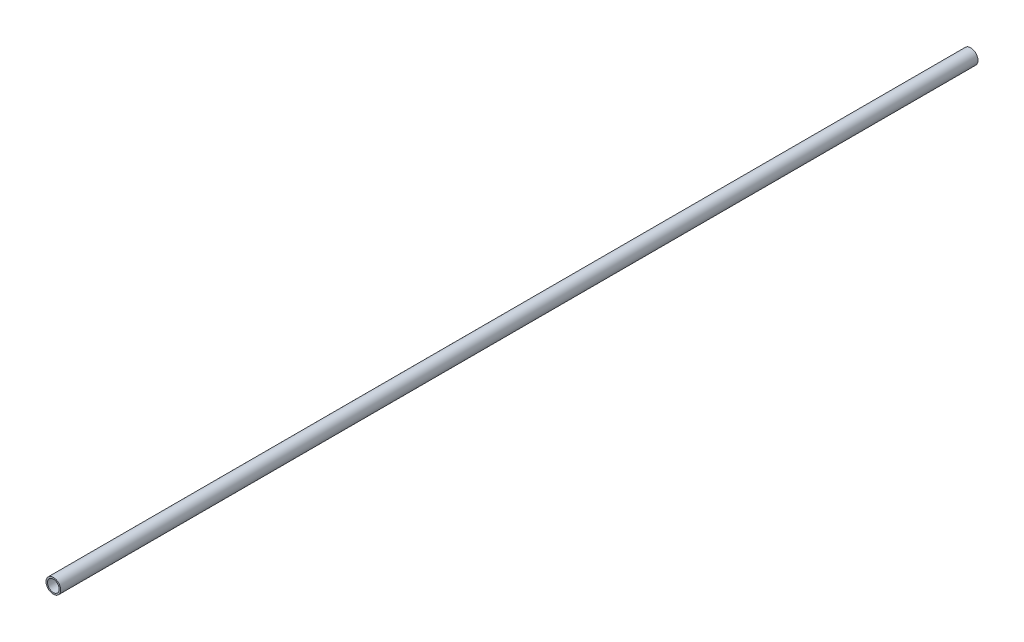
ISO-10303-21;
HEADER;
FILE_DESCRIPTION(('STEP AP214'),'2;1');
FILE_NAME('part.step','',(''),(''),'','','');
FILE_SCHEMA(('AUTOMOTIVE_DESIGN { 1 0 10303 214 1 1 1 1 }'));
ENDSEC;
DATA;
#1=APPLICATION_CONTEXT('core data for automotive mechanical design processes');
#2=APPLICATION_PROTOCOL_DEFINITION('international standard','automotive_design',2000,#1);
#3=PRODUCT_CONTEXT('',#1,'mechanical');
#4=PRODUCT('Part','Part','',(#3));
#5=PRODUCT_RELATED_PRODUCT_CATEGORY('part','',(#4));
#6=PRODUCT_DEFINITION_FORMATION('','',#4);
#7=PRODUCT_DEFINITION_CONTEXT('part definition',#1,'design');
#8=PRODUCT_DEFINITION('design','',#6,#7);
#9=PRODUCT_DEFINITION_SHAPE('','',#8);
#10=(LENGTH_UNIT() NAMED_UNIT(*) SI_UNIT(.MILLI.,.METRE.));
#11=(NAMED_UNIT(*) PLANE_ANGLE_UNIT() SI_UNIT($,.RADIAN.));
#12=(NAMED_UNIT(*) SI_UNIT($,.STERADIAN.) SOLID_ANGLE_UNIT());
#13=UNCERTAINTY_MEASURE_WITH_UNIT(LENGTH_MEASURE(1.E-05),#10,'distance_accuracy_value','');
#14=(GEOMETRIC_REPRESENTATION_CONTEXT(3) GLOBAL_UNCERTAINTY_ASSIGNED_CONTEXT((#13)) GLOBAL_UNIT_ASSIGNED_CONTEXT((#10,
#11,#12)) REPRESENTATION_CONTEXT('',''));
#15=CARTESIAN_POINT('',(0.,0.,0.));
#16=DIRECTION('',(0.,0.,1.));
#17=DIRECTION('',(1.,0.,0.));
#18=AXIS2_PLACEMENT_3D('',#15,#16,#17);
#19=CARTESIAN_POINT('',(0.,0.,0.));
#20=DIRECTION('',(0.,0.,-1.));
#21=DIRECTION('',(0.,-1.,0.));
#22=AXIS2_PLACEMENT_3D('',#19,#20,#21);
#23=CYLINDRICAL_SURFACE('',#22,13.335);
#24=CARTESIAN_POINT('',(0.,0.,-2095.5));
#25=DIRECTION('',(0.,0.,1.));
#26=DIRECTION('',(1.,0.,0.));
#27=AXIS2_PLACEMENT_3D('',#24,#25,#26);
#28=CIRCLE('',#27,13.335);
#29=CARTESIAN_POINT('',(13.335,0.,-2095.5));
#30=VERTEX_POINT('',#29);
#31=EDGE_CURVE('E24',#30,#30,#28,.T.);
#32=ORIENTED_EDGE('',*,*,#31,.F.);
#33=EDGE_LOOP('',(#32));
#34=FACE_BOUND('',#33,.T.);
#35=CARTESIAN_POINT('',(0.,0.,0.));
#36=DIRECTION('',(0.,0.,-1.));
#37=DIRECTION('',(0.,-1.,0.));
#38=AXIS2_PLACEMENT_3D('',#35,#36,#37);
#39=CIRCLE('',#38,13.335);
#40=CARTESIAN_POINT('',(0.,-13.335,0.));
#41=VERTEX_POINT('',#40);
#42=EDGE_CURVE('E28',#41,#41,#39,.T.);
#43=ORIENTED_EDGE('',*,*,#42,.F.);
#44=EDGE_LOOP('',(#43));
#45=FACE_BOUND('',#44,.T.);
#46=ADVANCED_FACE('F14',(#34,#45),#23,.F.);
#47=CARTESIAN_POINT('',(0.,0.,0.));
#48=DIRECTION('',(0.,0.,-1.));
#49=DIRECTION('',(0.,-1.,0.));
#50=AXIS2_PLACEMENT_3D('',#47,#48,#49);
#51=CYLINDRICAL_SURFACE('',#50,16.764);
#52=CARTESIAN_POINT('',(0.,0.,-2095.5));
#53=DIRECTION('',(0.,0.,-1.));
#54=DIRECTION('',(0.,-1.,0.));
#55=AXIS2_PLACEMENT_3D('',#52,#53,#54);
#56=CIRCLE('',#55,16.764);
#57=CARTESIAN_POINT('',(0.,-16.764,-2095.5));
#58=VERTEX_POINT('',#57);
#59=EDGE_CURVE('E20',#58,#58,#56,.T.);
#60=ORIENTED_EDGE('',*,*,#59,.F.);
#61=EDGE_LOOP('',(#60));
#62=FACE_BOUND('',#61,.T.);
#63=CARTESIAN_POINT('',(0.,0.,0.));
#64=DIRECTION('',(0.,0.,-1.));
#65=DIRECTION('',(0.,-1.,0.));
#66=AXIS2_PLACEMENT_3D('',#63,#64,#65);
#67=CIRCLE('',#66,16.764);
#68=CARTESIAN_POINT('',(0.,-16.764,0.));
#69=VERTEX_POINT('',#68);
#70=EDGE_CURVE('E9',#69,#69,#67,.T.);
#71=ORIENTED_EDGE('',*,*,#70,.T.);
#72=EDGE_LOOP('',(#71));
#73=FACE_BOUND('',#72,.T.);
#74=ADVANCED_FACE('F37',(#62,#73),#51,.T.);
#75=CARTESIAN_POINT('',(0.,0.,-2095.5));
#76=DIRECTION('',(0.,0.,1.));
#77=DIRECTION('',(1.,0.,0.));
#78=AXIS2_PLACEMENT_3D('',#75,#76,#77);
#79=PLANE('',#78);
#80=ORIENTED_EDGE('',*,*,#59,.T.);
#81=EDGE_LOOP('',(#80));
#82=FACE_BOUND('',#81,.T.);
#83=ORIENTED_EDGE('',*,*,#31,.T.);
#84=EDGE_LOOP('',(#83));
#85=FACE_BOUND('',#84,.T.);
#86=ADVANCED_FACE('F43',(#82,#85),#79,.F.);
#87=CARTESIAN_POINT('',(0.,0.,0.));
#88=DIRECTION('',(0.,0.,1.));
#89=DIRECTION('',(1.,0.,0.));
#90=AXIS2_PLACEMENT_3D('',#87,#88,#89);
#91=PLANE('',#90);
#92=ORIENTED_EDGE('',*,*,#70,.F.);
#93=EDGE_LOOP('',(#92));
#94=FACE_BOUND('',#93,.T.);
#95=ORIENTED_EDGE('',*,*,#42,.T.);
#96=EDGE_LOOP('',(#95));
#97=FACE_BOUND('',#96,.T.);
#98=ADVANCED_FACE('F34',(#94,#97),#91,.T.);
#99=CLOSED_SHELL('',(#46,#74,#86,#98));
#100=MANIFOLD_SOLID_BREP('B1',#99);
#101=ADVANCED_BREP_SHAPE_REPRESENTATION('',(#18,#100),#14);
#102=SHAPE_DEFINITION_REPRESENTATION(#9,#101);
ENDSEC;
END-ISO-10303-21;
